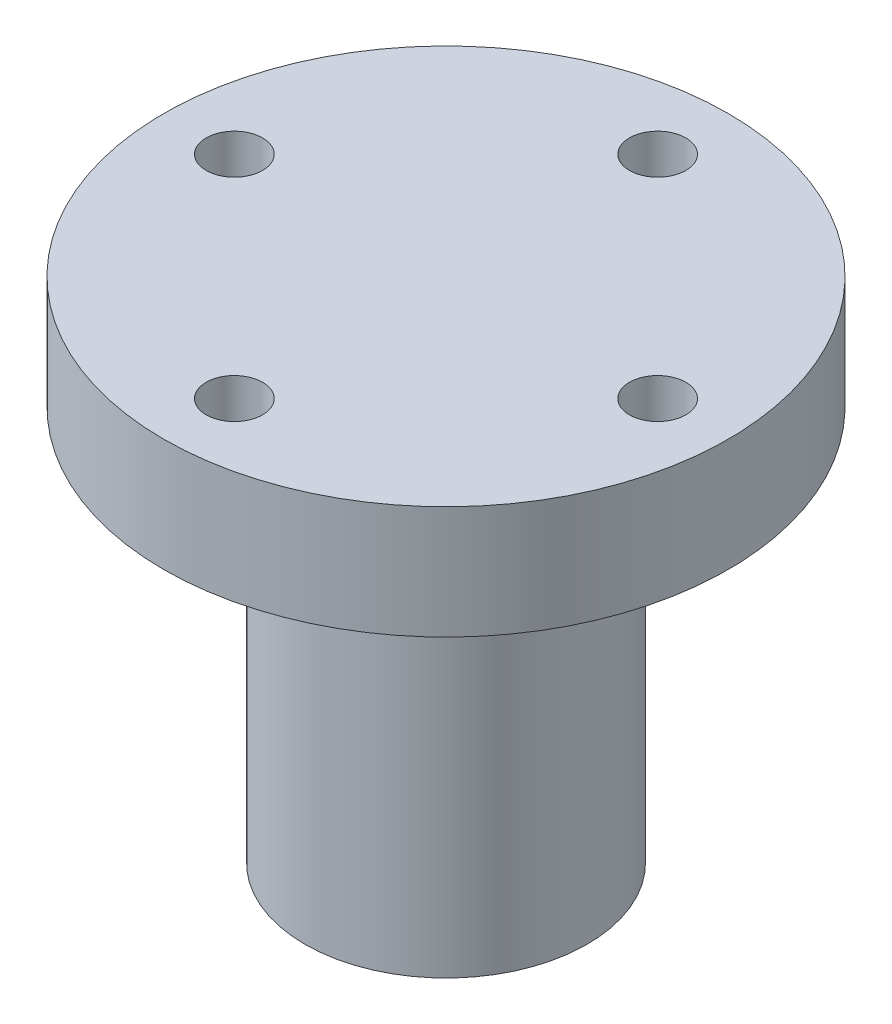
ISO-10303-21;
HEADER;
FILE_DESCRIPTION(('STEP AP214'),'2;1');
FILE_NAME('part.step','',(''),(''),'','','');
FILE_SCHEMA(('AUTOMOTIVE_DESIGN { 1 0 10303 214 1 1 1 1 }'));
ENDSEC;
DATA;
#1=APPLICATION_CONTEXT('core data for automotive mechanical design processes');
#2=APPLICATION_PROTOCOL_DEFINITION('international standard','automotive_design',2000,#1);
#3=PRODUCT_CONTEXT('',#1,'mechanical');
#4=PRODUCT('Part','Part','',(#3));
#5=PRODUCT_RELATED_PRODUCT_CATEGORY('part','',(#4));
#6=PRODUCT_DEFINITION_FORMATION('','',#4);
#7=PRODUCT_DEFINITION_CONTEXT('part definition',#1,'design');
#8=PRODUCT_DEFINITION('design','',#6,#7);
#9=PRODUCT_DEFINITION_SHAPE('','',#8);
#10=(LENGTH_UNIT() NAMED_UNIT(*) SI_UNIT(.MILLI.,.METRE.));
#11=(NAMED_UNIT(*) PLANE_ANGLE_UNIT() SI_UNIT($,.RADIAN.));
#12=(NAMED_UNIT(*) SI_UNIT($,.STERADIAN.) SOLID_ANGLE_UNIT());
#13=UNCERTAINTY_MEASURE_WITH_UNIT(LENGTH_MEASURE(1.E-05),#10,'distance_accuracy_value','');
#14=(GEOMETRIC_REPRESENTATION_CONTEXT(3) GLOBAL_UNCERTAINTY_ASSIGNED_CONTEXT((#13)) GLOBAL_UNIT_ASSIGNED_CONTEXT((#10,
#11,#12)) REPRESENTATION_CONTEXT('',''));
#15=CARTESIAN_POINT('',(0.,0.,0.));
#16=DIRECTION('',(0.,0.,1.));
#17=DIRECTION('',(1.,0.,0.));
#18=AXIS2_PLACEMENT_3D('',#15,#16,#17);
#19=CARTESIAN_POINT('',(0.,35.,0.));
#20=DIRECTION('',(0.,-1.,0.));
#21=DIRECTION('',(0.,0.,-1.));
#22=AXIS2_PLACEMENT_3D('',#19,#20,#21);
#23=CYLINDRICAL_SURFACE('',#22,25.);
#24=CARTESIAN_POINT('',(0.,35.,0.));
#25=DIRECTION('',(0.,1.,0.));
#26=DIRECTION('',(0.,0.,1.));
#27=AXIS2_PLACEMENT_3D('',#24,#25,#26);
#28=CIRCLE('',#27,25.);
#29=CARTESIAN_POINT('',(0.,35.,25.));
#30=VERTEX_POINT('',#29);
#31=EDGE_CURVE('E10',#30,#30,#28,.T.);
#32=ORIENTED_EDGE('',*,*,#31,.F.);
#33=EDGE_LOOP('',(#32));
#34=FACE_BOUND('',#33,.T.);
#35=CARTESIAN_POINT('',(0.,-35.,0.));
#36=DIRECTION('',(0.,1.,0.));
#37=DIRECTION('',(0.,0.,1.));
#38=AXIS2_PLACEMENT_3D('',#35,#36,#37);
#39=CIRCLE('',#38,25.);
#40=CARTESIAN_POINT('',(0.,-35.,25.));
#41=VERTEX_POINT('',#40);
#42=EDGE_CURVE('E34',#41,#41,#39,.T.);
#43=ORIENTED_EDGE('',*,*,#42,.T.);
#44=EDGE_LOOP('',(#43));
#45=FACE_BOUND('',#44,.T.);
#46=ADVANCED_FACE('F31',(#34,#45),#23,.T.);
#47=CARTESIAN_POINT('',(0.,-35.,0.));
#48=DIRECTION('',(0.,1.,0.));
#49=DIRECTION('',(0.,0.,1.));
#50=AXIS2_PLACEMENT_3D('',#47,#48,#49);
#51=PLANE('',#50);
#52=ORIENTED_EDGE('',*,*,#42,.F.);
#53=EDGE_LOOP('',(#52));
#54=FACE_BOUND('',#53,.T.);
#55=ADVANCED_FACE('F92',(#54),#51,.F.);
#56=CARTESIAN_POINT('',(0.,55.,0.));
#57=DIRECTION('',(0.,-1.,0.));
#58=DIRECTION('',(0.,0.,-1.));
#59=AXIS2_PLACEMENT_3D('',#56,#57,#58);
#60=CYLINDRICAL_SURFACE('',#59,50.);
#61=CARTESIAN_POINT('',(0.,55.,0.));
#62=DIRECTION('',(0.,1.,0.));
#63=DIRECTION('',(0.,0.,1.));
#64=AXIS2_PLACEMENT_3D('',#61,#62,#63);
#65=CIRCLE('',#64,50.);
#66=CARTESIAN_POINT('',(0.,55.,50.));
#67=VERTEX_POINT('',#66);
#68=EDGE_CURVE('E41',#67,#67,#65,.T.);
#69=ORIENTED_EDGE('',*,*,#68,.F.);
#70=EDGE_LOOP('',(#69));
#71=FACE_BOUND('',#70,.T.);
#72=CARTESIAN_POINT('',(0.,35.,0.));
#73=DIRECTION('',(0.,1.,0.));
#74=DIRECTION('',(0.,0.,1.));
#75=AXIS2_PLACEMENT_3D('',#72,#73,#74);
#76=CIRCLE('',#75,50.);
#77=CARTESIAN_POINT('',(0.,35.,50.));
#78=VERTEX_POINT('',#77);
#79=EDGE_CURVE('E43',#78,#78,#76,.T.);
#80=ORIENTED_EDGE('',*,*,#79,.T.);
#81=EDGE_LOOP('',(#80));
#82=FACE_BOUND('',#81,.T.);
#83=ADVANCED_FACE('F80',(#71,#82),#60,.T.);
#84=CARTESIAN_POINT('',(0.,55.,0.));
#85=DIRECTION('',(0.,1.,0.));
#86=DIRECTION('',(0.,0.,1.));
#87=AXIS2_PLACEMENT_3D('',#84,#85,#86);
#88=PLANE('',#87);
#89=CARTESIAN_POINT('',(0.,55.,-37.5));
#90=DIRECTION('',(0.,1.,0.));
#91=DIRECTION('',(0.,0.,1.));
#92=AXIS2_PLACEMENT_3D('',#89,#90,#91);
#93=CIRCLE('',#92,5.);
#94=CARTESIAN_POINT('',(0.,55.,-32.5));
#95=VERTEX_POINT('',#94);
#96=EDGE_CURVE('E65',#95,#95,#93,.T.);
#97=ORIENTED_EDGE('',*,*,#96,.F.);
#98=EDGE_LOOP('',(#97));
#99=FACE_BOUND('',#98,.T.);
#100=CARTESIAN_POINT('',(37.5,55.,1.30930550206618E-13));
#101=DIRECTION('',(0.,1.,0.));
#102=DIRECTION('',(0.,0.,1.));
#103=AXIS2_PLACEMENT_3D('',#100,#101,#102);
#104=CIRCLE('',#103,5.);
#105=CARTESIAN_POINT('',(37.5,55.,5.00000000000013));
#106=VERTEX_POINT('',#105);
#107=EDGE_CURVE('E59',#106,#106,#104,.T.);
#108=ORIENTED_EDGE('',*,*,#107,.F.);
#109=EDGE_LOOP('',(#108));
#110=FACE_BOUND('',#109,.T.);
#111=CARTESIAN_POINT('',(-2.61861100413235E-13,55.,37.5));
#112=DIRECTION('',(0.,1.,0.));
#113=DIRECTION('',(0.,0.,1.));
#114=AXIS2_PLACEMENT_3D('',#111,#112,#113);
#115=CIRCLE('',#114,5.);
#116=CARTESIAN_POINT('',(-2.61861100413235E-13,55.,42.5));
#117=VERTEX_POINT('',#116);
#118=EDGE_CURVE('E52',#117,#117,#115,.T.);
#119=ORIENTED_EDGE('',*,*,#118,.F.);
#120=EDGE_LOOP('',(#119));
#121=FACE_BOUND('',#120,.T.);
#122=CARTESIAN_POINT('',(-37.5,55.,-3.92791650619852E-13));
#123=DIRECTION('',(0.,1.,0.));
#124=DIRECTION('',(0.,0.,1.));
#125=AXIS2_PLACEMENT_3D('',#122,#123,#124);
#126=CIRCLE('',#125,5.);
#127=CARTESIAN_POINT('',(-37.5,55.,4.99999999999961));
#128=VERTEX_POINT('',#127);
#129=EDGE_CURVE('E53',#128,#128,#126,.T.);
#130=ORIENTED_EDGE('',*,*,#129,.F.);
#131=EDGE_LOOP('',(#130));
#132=FACE_BOUND('',#131,.T.);
#133=ORIENTED_EDGE('',*,*,#68,.T.);
#134=EDGE_LOOP('',(#133));
#135=FACE_BOUND('',#134,.T.);
#136=ADVANCED_FACE('F76',(#99,#110,#121,#132,#135),#88,.T.);
#137=CARTESIAN_POINT('',(0.,35.,0.));
#138=DIRECTION('',(0.,1.,0.));
#139=DIRECTION('',(0.,0.,1.));
#140=AXIS2_PLACEMENT_3D('',#137,#138,#139);
#141=PLANE('',#140);
#142=CARTESIAN_POINT('',(0.,35.,-37.5));
#143=DIRECTION('',(0.,1.,0.));
#144=DIRECTION('',(0.,0.,1.));
#145=AXIS2_PLACEMENT_3D('',#142,#143,#144);
#146=CIRCLE('',#145,5.);
#147=CARTESIAN_POINT('',(0.,35.,-32.5));
#148=VERTEX_POINT('',#147);
#149=EDGE_CURVE('E46',#148,#148,#146,.F.);
#150=ORIENTED_EDGE('',*,*,#149,.F.);
#151=EDGE_LOOP('',(#150));
#152=FACE_BOUND('',#151,.T.);
#153=CARTESIAN_POINT('',(37.5,35.,1.30930550206618E-13));
#154=DIRECTION('',(0.,1.,0.));
#155=DIRECTION('',(0.,0.,1.));
#156=AXIS2_PLACEMENT_3D('',#153,#154,#155);
#157=CIRCLE('',#156,5.);
#158=CARTESIAN_POINT('',(37.5,35.,5.00000000000013));
#159=VERTEX_POINT('',#158);
#160=EDGE_CURVE('E62',#159,#159,#157,.F.);
#161=ORIENTED_EDGE('',*,*,#160,.F.);
#162=EDGE_LOOP('',(#161));
#163=FACE_BOUND('',#162,.T.);
#164=CARTESIAN_POINT('',(-2.61861100413235E-13,35.,37.5));
#165=DIRECTION('',(0.,1.,0.));
#166=DIRECTION('',(0.,0.,1.));
#167=AXIS2_PLACEMENT_3D('',#164,#165,#166);
#168=CIRCLE('',#167,5.);
#169=CARTESIAN_POINT('',(-2.61861100413235E-13,35.,42.5));
#170=VERTEX_POINT('',#169);
#171=EDGE_CURVE('E56',#170,#170,#168,.F.);
#172=ORIENTED_EDGE('',*,*,#171,.F.);
#173=EDGE_LOOP('',(#172));
#174=FACE_BOUND('',#173,.T.);
#175=CARTESIAN_POINT('',(-37.5,35.,-3.92791650619852E-13));
#176=DIRECTION('',(0.,1.,0.));
#177=DIRECTION('',(0.,0.,1.));
#178=AXIS2_PLACEMENT_3D('',#175,#176,#177);
#179=CIRCLE('',#178,5.);
#180=CARTESIAN_POINT('',(-37.5,35.,4.99999999999961));
#181=VERTEX_POINT('',#180);
#182=EDGE_CURVE('E49',#181,#181,#179,.F.);
#183=ORIENTED_EDGE('',*,*,#182,.F.);
#184=EDGE_LOOP('',(#183));
#185=FACE_BOUND('',#184,.T.);
#186=ORIENTED_EDGE('',*,*,#31,.T.);
#187=EDGE_LOOP('',(#186));
#188=FACE_BOUND('',#187,.T.);
#189=ORIENTED_EDGE('',*,*,#79,.F.);
#190=EDGE_LOOP('',(#189));
#191=FACE_BOUND('',#190,.T.);
#192=ADVANCED_FACE('F79',(#152,#163,#174,#185,#188,#191),#141,.F.);
#193=CARTESIAN_POINT('',(-37.5,-35.001,-3.92791650619852E-13));
#194=DIRECTION('',(0.,1.,0.));
#195=DIRECTION('',(0.,0.,1.));
#196=AXIS2_PLACEMENT_3D('',#193,#194,#195);
#197=CYLINDRICAL_SURFACE('',#196,5.);
#198=CARTESIAN_POINT('',(-37.5,55.,4.99999999999961));
#199=CARTESIAN_POINT('',(-37.5,54.7916666666667,4.99999999999961));
#200=CARTESIAN_POINT('',(-37.5,54.5833333333333,4.99999999999961));
#201=CARTESIAN_POINT('',(-37.5,54.1666666666667,4.99999999999961));
#202=CARTESIAN_POINT('',(-37.5,53.9583333333333,4.99999999999961));
#203=CARTESIAN_POINT('',(-37.5,53.5416666666667,4.99999999999961));
#204=CARTESIAN_POINT('',(-37.5,53.3333333333333,4.99999999999961));
#205=CARTESIAN_POINT('',(-37.5,52.9166666666667,4.99999999999961));
#206=CARTESIAN_POINT('',(-37.5,52.7083333333333,4.99999999999961));
#207=CARTESIAN_POINT('',(-37.5,52.2916666666667,4.99999999999961));
#208=CARTESIAN_POINT('',(-37.5,52.0833333333333,4.99999999999961));
#209=CARTESIAN_POINT('',(-37.5,51.6666666666667,4.99999999999961));
#210=CARTESIAN_POINT('',(-37.5,51.4583333333333,4.99999999999961));
#211=CARTESIAN_POINT('',(-37.5,51.0416666666667,4.99999999999961));
#212=CARTESIAN_POINT('',(-37.5,50.8333333333333,4.99999999999961));
#213=CARTESIAN_POINT('',(-37.5,50.4166666666667,4.99999999999961));
#214=CARTESIAN_POINT('',(-37.5,50.2083333333333,4.99999999999961));
#215=CARTESIAN_POINT('',(-37.5,49.7916666666667,4.99999999999961));
#216=CARTESIAN_POINT('',(-37.5,49.5833333333333,4.99999999999961));
#217=CARTESIAN_POINT('',(-37.5,49.1666666666667,4.99999999999961));
#218=CARTESIAN_POINT('',(-37.5,48.9583333333333,4.99999999999961));
#219=CARTESIAN_POINT('',(-37.5,48.5416666666667,4.99999999999961));
#220=CARTESIAN_POINT('',(-37.5,48.3333333333333,4.99999999999961));
#221=CARTESIAN_POINT('',(-37.5,47.9166666666667,4.99999999999961));
#222=CARTESIAN_POINT('',(-37.5,47.7083333333333,4.99999999999961));
#223=CARTESIAN_POINT('',(-37.5,47.2916666666667,4.99999999999961));
#224=CARTESIAN_POINT('',(-37.5,47.0833333333333,4.99999999999961));
#225=CARTESIAN_POINT('',(-37.5,46.6666666666667,4.99999999999961));
#226=CARTESIAN_POINT('',(-37.5,46.4583333333333,4.99999999999961));
#227=CARTESIAN_POINT('',(-37.5,46.0416666666667,4.99999999999961));
#228=CARTESIAN_POINT('',(-37.5,45.8333333333333,4.99999999999961));
#229=CARTESIAN_POINT('',(-37.5,45.4166666666667,4.99999999999961));
#230=CARTESIAN_POINT('',(-37.5,45.2083333333333,4.99999999999961));
#231=CARTESIAN_POINT('',(-37.5,44.7916666666667,4.99999999999961));
#232=CARTESIAN_POINT('',(-37.5,44.5833333333333,4.99999999999961));
#233=CARTESIAN_POINT('',(-37.5,44.1666666666667,4.99999999999961));
#234=CARTESIAN_POINT('',(-37.5,43.9583333333333,4.99999999999961));
#235=CARTESIAN_POINT('',(-37.5,43.5416666666667,4.99999999999961));
#236=CARTESIAN_POINT('',(-37.5,43.3333333333333,4.99999999999961));
#237=CARTESIAN_POINT('',(-37.5,42.9166666666667,4.99999999999961));
#238=CARTESIAN_POINT('',(-37.5,42.7083333333333,4.99999999999961));
#239=CARTESIAN_POINT('',(-37.5,42.2916666666667,4.99999999999961));
#240=CARTESIAN_POINT('',(-37.5,42.0833333333333,4.99999999999961));
#241=CARTESIAN_POINT('',(-37.5,41.6666666666667,4.99999999999961));
#242=CARTESIAN_POINT('',(-37.5,41.4583333333333,4.99999999999961));
#243=CARTESIAN_POINT('',(-37.5,41.0416666666667,4.99999999999961));
#244=CARTESIAN_POINT('',(-37.5,40.8333333333333,4.99999999999961));
#245=CARTESIAN_POINT('',(-37.5,40.4166666666667,4.99999999999961));
#246=CARTESIAN_POINT('',(-37.5,40.2083333333333,4.99999999999961));
#247=CARTESIAN_POINT('',(-37.5,39.7916666666667,4.99999999999961));
#248=CARTESIAN_POINT('',(-37.5,39.5833333333333,4.99999999999961));
#249=CARTESIAN_POINT('',(-37.5,39.1666666666667,4.99999999999961));
#250=CARTESIAN_POINT('',(-37.5,38.9583333333333,4.99999999999961));
#251=CARTESIAN_POINT('',(-37.5,38.5416666666667,4.99999999999961));
#252=CARTESIAN_POINT('',(-37.5,38.3333333333333,4.99999999999961));
#253=CARTESIAN_POINT('',(-37.5,37.9166666666667,4.99999999999961));
#254=CARTESIAN_POINT('',(-37.5,37.7083333333333,4.99999999999961));
#255=CARTESIAN_POINT('',(-37.5,37.2916666666667,4.99999999999961));
#256=CARTESIAN_POINT('',(-37.5,37.0833333333333,4.99999999999961));
#257=CARTESIAN_POINT('',(-37.5,36.6666666666667,4.99999999999961));
#258=CARTESIAN_POINT('',(-37.5,36.4583333333333,4.99999999999961));
#259=CARTESIAN_POINT('',(-37.5,36.0416666666667,4.99999999999961));
#260=CARTESIAN_POINT('',(-37.5,35.8333333333333,4.99999999999961));
#261=CARTESIAN_POINT('',(-37.5,35.4166666666667,4.99999999999961));
#262=CARTESIAN_POINT('',(-37.5,35.2083333333333,4.99999999999961));
#263=CARTESIAN_POINT('',(-37.5,35.,4.99999999999961));
#264=B_SPLINE_CURVE_WITH_KNOTS('',3,(#198,#199,#200,#201,#202,#203,#204,#205,#206,#207,#208,
#209,#210,#211,#212,#213,#214,#215,#216,#217,#218,#219,#220,#221,#222,#223,#224,#225,#226,#227,
#228,#229,#230,#231,#232,#233,#234,#235,#236,#237,#238,#239,#240,#241,#242,#243,#244,#245,#246,
#247,#248,#249,#250,#251,#252,#253,#254,#255,#256,#257,#258,#259,#260,#261,#262,#263),
.UNSPECIFIED.,.F.,.F.,(4,2,2,2,2,2,2,2,2,2,2,2,2,2,2,2,2,2,2,2,2,2,2,2,2,2,2,2,2,2,2,2,4),(0.,
0.625000000000001,1.25,1.875,2.5,3.125,3.75,4.375,5.,5.62500000000001,6.25000000000001,
6.87500000000001,7.50000000000001,8.12500000000001,8.75000000000001,9.37500000000001,10.,10.625,
11.25,11.875,12.5,13.125,13.75,14.375,15.,15.625,16.25,16.875,17.5,18.125,18.75,19.375,20.),.UNSPECIFIED.);
#265=EDGE_CURVE('BSEAM97',#128,#181,#264,.T.);
#266=ORIENTED_EDGE('',*,*,#129,.T.);
#267=ORIENTED_EDGE('',*,*,#182,.T.);
#268=ORIENTED_EDGE('',*,*,#265,.T.);
#269=ORIENTED_EDGE('',*,*,#265,.F.);
#270=EDGE_LOOP('',(#266,#268,#267,#269));
#271=FACE_BOUND('',#270,.T.);
#272=ADVANCED_FACE('F97',(#271),#197,.F.);
#273=CARTESIAN_POINT('',(-2.61861100413235E-13,-35.001,37.5));
#274=DIRECTION('',(0.,1.,0.));
#275=DIRECTION('',(0.,0.,1.));
#276=AXIS2_PLACEMENT_3D('',#273,#274,#275);
#277=CYLINDRICAL_SURFACE('',#276,5.);
#278=CARTESIAN_POINT('',(-2.61861100413235E-13,55.,42.5));
#279=CARTESIAN_POINT('',(-2.61861100413235E-13,54.7916666666667,42.5));
#280=CARTESIAN_POINT('',(-2.61861100413235E-13,54.5833333333333,42.5));
#281=CARTESIAN_POINT('',(-2.61861100413235E-13,54.1666666666667,42.5));
#282=CARTESIAN_POINT('',(-2.61861100413235E-13,53.9583333333333,42.5));
#283=CARTESIAN_POINT('',(-2.61861100413235E-13,53.5416666666667,42.5));
#284=CARTESIAN_POINT('',(-2.61861100413235E-13,53.3333333333333,42.5));
#285=CARTESIAN_POINT('',(-2.61861100413235E-13,52.9166666666667,42.5));
#286=CARTESIAN_POINT('',(-2.61861100413235E-13,52.7083333333333,42.5));
#287=CARTESIAN_POINT('',(-2.61861100413235E-13,52.2916666666667,42.5));
#288=CARTESIAN_POINT('',(-2.61861100413235E-13,52.0833333333333,42.5));
#289=CARTESIAN_POINT('',(-2.61861100413235E-13,51.6666666666667,42.5));
#290=CARTESIAN_POINT('',(-2.61861100413235E-13,51.4583333333333,42.5));
#291=CARTESIAN_POINT('',(-2.61861100413235E-13,51.0416666666667,42.5));
#292=CARTESIAN_POINT('',(-2.61861100413235E-13,50.8333333333333,42.5));
#293=CARTESIAN_POINT('',(-2.61861100413235E-13,50.4166666666667,42.5));
#294=CARTESIAN_POINT('',(-2.61861100413235E-13,50.2083333333333,42.5));
#295=CARTESIAN_POINT('',(-2.61861100413235E-13,49.7916666666667,42.5));
#296=CARTESIAN_POINT('',(-2.61861100413235E-13,49.5833333333333,42.5));
#297=CARTESIAN_POINT('',(-2.61861100413235E-13,49.1666666666667,42.5));
#298=CARTESIAN_POINT('',(-2.61861100413235E-13,48.9583333333333,42.5));
#299=CARTESIAN_POINT('',(-2.61861100413235E-13,48.5416666666667,42.5));
#300=CARTESIAN_POINT('',(-2.61861100413235E-13,48.3333333333333,42.5));
#301=CARTESIAN_POINT('',(-2.61861100413235E-13,47.9166666666667,42.5));
#302=CARTESIAN_POINT('',(-2.61861100413235E-13,47.7083333333333,42.5));
#303=CARTESIAN_POINT('',(-2.61861100413235E-13,47.2916666666667,42.5));
#304=CARTESIAN_POINT('',(-2.61861100413235E-13,47.0833333333333,42.5));
#305=CARTESIAN_POINT('',(-2.61861100413235E-13,46.6666666666667,42.5));
#306=CARTESIAN_POINT('',(-2.61861100413235E-13,46.4583333333333,42.5));
#307=CARTESIAN_POINT('',(-2.61861100413235E-13,46.0416666666667,42.5));
#308=CARTESIAN_POINT('',(-2.61861100413235E-13,45.8333333333333,42.5));
#309=CARTESIAN_POINT('',(-2.61861100413235E-13,45.4166666666667,42.5));
#310=CARTESIAN_POINT('',(-2.61861100413235E-13,45.2083333333333,42.5));
#311=CARTESIAN_POINT('',(-2.61861100413235E-13,44.7916666666667,42.5));
#312=CARTESIAN_POINT('',(-2.61861100413235E-13,44.5833333333333,42.5));
#313=CARTESIAN_POINT('',(-2.61861100413235E-13,44.1666666666667,42.5));
#314=CARTESIAN_POINT('',(-2.61861100413235E-13,43.9583333333333,42.5));
#315=CARTESIAN_POINT('',(-2.61861100413235E-13,43.5416666666667,42.5));
#316=CARTESIAN_POINT('',(-2.61861100413235E-13,43.3333333333333,42.5));
#317=CARTESIAN_POINT('',(-2.61861100413235E-13,42.9166666666667,42.5));
#318=CARTESIAN_POINT('',(-2.61861100413235E-13,42.7083333333333,42.5));
#319=CARTESIAN_POINT('',(-2.61861100413235E-13,42.2916666666667,42.5));
#320=CARTESIAN_POINT('',(-2.61861100413235E-13,42.0833333333333,42.5));
#321=CARTESIAN_POINT('',(-2.61861100413235E-13,41.6666666666667,42.5));
#322=CARTESIAN_POINT('',(-2.61861100413235E-13,41.4583333333333,42.5));
#323=CARTESIAN_POINT('',(-2.61861100413235E-13,41.0416666666667,42.5));
#324=CARTESIAN_POINT('',(-2.61861100413235E-13,40.8333333333333,42.5));
#325=CARTESIAN_POINT('',(-2.61861100413235E-13,40.4166666666667,42.5));
#326=CARTESIAN_POINT('',(-2.61861100413235E-13,40.2083333333333,42.5));
#327=CARTESIAN_POINT('',(-2.61861100413235E-13,39.7916666666667,42.5));
#328=CARTESIAN_POINT('',(-2.61861100413235E-13,39.5833333333333,42.5));
#329=CARTESIAN_POINT('',(-2.61861100413235E-13,39.1666666666667,42.5));
#330=CARTESIAN_POINT('',(-2.61861100413235E-13,38.9583333333333,42.5));
#331=CARTESIAN_POINT('',(-2.61861100413235E-13,38.5416666666667,42.5));
#332=CARTESIAN_POINT('',(-2.61861100413235E-13,38.3333333333333,42.5));
#333=CARTESIAN_POINT('',(-2.61861100413235E-13,37.9166666666667,42.5));
#334=CARTESIAN_POINT('',(-2.61861100413235E-13,37.7083333333333,42.5));
#335=CARTESIAN_POINT('',(-2.61861100413235E-13,37.2916666666667,42.5));
#336=CARTESIAN_POINT('',(-2.61861100413235E-13,37.0833333333333,42.5));
#337=CARTESIAN_POINT('',(-2.61861100413235E-13,36.6666666666667,42.5));
#338=CARTESIAN_POINT('',(-2.61861100413235E-13,36.4583333333333,42.5));
#339=CARTESIAN_POINT('',(-2.61861100413235E-13,36.0416666666667,42.5));
#340=CARTESIAN_POINT('',(-2.61861100413235E-13,35.8333333333333,42.5));
#341=CARTESIAN_POINT('',(-2.61861100413235E-13,35.4166666666667,42.5));
#342=CARTESIAN_POINT('',(-2.61861100413235E-13,35.2083333333333,42.5));
#343=CARTESIAN_POINT('',(-2.61861100413235E-13,35.,42.5));
#344=B_SPLINE_CURVE_WITH_KNOTS('',3,(#278,#279,#280,#281,#282,#283,#284,#285,#286,#287,#288,
#289,#290,#291,#292,#293,#294,#295,#296,#297,#298,#299,#300,#301,#302,#303,#304,#305,#306,#307,
#308,#309,#310,#311,#312,#313,#314,#315,#316,#317,#318,#319,#320,#321,#322,#323,#324,#325,#326,
#327,#328,#329,#330,#331,#332,#333,#334,#335,#336,#337,#338,#339,#340,#341,#342,#343),
.UNSPECIFIED.,.F.,.F.,(4,2,2,2,2,2,2,2,2,2,2,2,2,2,2,2,2,2,2,2,2,2,2,2,2,2,2,2,2,2,2,2,4),(0.,
0.625000000000001,1.25,1.875,2.5,3.125,3.75,4.375,5.,5.62500000000001,6.25000000000001,
6.87500000000001,7.50000000000001,8.12500000000001,8.75000000000001,9.37500000000001,10.,10.625,
11.25,11.875,12.5,13.125,13.75,14.375,15.,15.625,16.25,16.875,17.5,18.125,18.75,19.375,20.),.UNSPECIFIED.);
#345=EDGE_CURVE('BSEAM103',#117,#170,#344,.T.);
#346=ORIENTED_EDGE('',*,*,#118,.T.);
#347=ORIENTED_EDGE('',*,*,#171,.T.);
#348=ORIENTED_EDGE('',*,*,#345,.T.);
#349=ORIENTED_EDGE('',*,*,#345,.F.);
#350=EDGE_LOOP('',(#346,#348,#347,#349));
#351=FACE_BOUND('',#350,.T.);
#352=ADVANCED_FACE('F103',(#351),#277,.F.);
#353=CARTESIAN_POINT('',(37.5,-35.001,1.30930550206618E-13));
#354=DIRECTION('',(0.,1.,0.));
#355=DIRECTION('',(0.,0.,1.));
#356=AXIS2_PLACEMENT_3D('',#353,#354,#355);
#357=CYLINDRICAL_SURFACE('',#356,5.);
#358=CARTESIAN_POINT('',(37.5,55.,5.00000000000013));
#359=CARTESIAN_POINT('',(37.5,54.7916666666667,5.00000000000013));
#360=CARTESIAN_POINT('',(37.5,54.5833333333333,5.00000000000013));
#361=CARTESIAN_POINT('',(37.5,54.1666666666667,5.00000000000013));
#362=CARTESIAN_POINT('',(37.5,53.9583333333333,5.00000000000013));
#363=CARTESIAN_POINT('',(37.5,53.5416666666667,5.00000000000013));
#364=CARTESIAN_POINT('',(37.5,53.3333333333333,5.00000000000013));
#365=CARTESIAN_POINT('',(37.5,52.9166666666667,5.00000000000013));
#366=CARTESIAN_POINT('',(37.5,52.7083333333333,5.00000000000013));
#367=CARTESIAN_POINT('',(37.5,52.2916666666667,5.00000000000013));
#368=CARTESIAN_POINT('',(37.5,52.0833333333333,5.00000000000013));
#369=CARTESIAN_POINT('',(37.5,51.6666666666667,5.00000000000013));
#370=CARTESIAN_POINT('',(37.5,51.4583333333333,5.00000000000013));
#371=CARTESIAN_POINT('',(37.5,51.0416666666667,5.00000000000013));
#372=CARTESIAN_POINT('',(37.5,50.8333333333333,5.00000000000013));
#373=CARTESIAN_POINT('',(37.5,50.4166666666667,5.00000000000013));
#374=CARTESIAN_POINT('',(37.5,50.2083333333333,5.00000000000013));
#375=CARTESIAN_POINT('',(37.5,49.7916666666667,5.00000000000013));
#376=CARTESIAN_POINT('',(37.5,49.5833333333333,5.00000000000013));
#377=CARTESIAN_POINT('',(37.5,49.1666666666667,5.00000000000013));
#378=CARTESIAN_POINT('',(37.5,48.9583333333333,5.00000000000013));
#379=CARTESIAN_POINT('',(37.5,48.5416666666667,5.00000000000013));
#380=CARTESIAN_POINT('',(37.5,48.3333333333333,5.00000000000013));
#381=CARTESIAN_POINT('',(37.5,47.9166666666667,5.00000000000013));
#382=CARTESIAN_POINT('',(37.5,47.7083333333333,5.00000000000013));
#383=CARTESIAN_POINT('',(37.5,47.2916666666667,5.00000000000013));
#384=CARTESIAN_POINT('',(37.5,47.0833333333333,5.00000000000013));
#385=CARTESIAN_POINT('',(37.5,46.6666666666667,5.00000000000013));
#386=CARTESIAN_POINT('',(37.5,46.4583333333333,5.00000000000013));
#387=CARTESIAN_POINT('',(37.5,46.0416666666667,5.00000000000013));
#388=CARTESIAN_POINT('',(37.5,45.8333333333333,5.00000000000013));
#389=CARTESIAN_POINT('',(37.5,45.4166666666667,5.00000000000013));
#390=CARTESIAN_POINT('',(37.5,45.2083333333333,5.00000000000013));
#391=CARTESIAN_POINT('',(37.5,44.7916666666667,5.00000000000013));
#392=CARTESIAN_POINT('',(37.5,44.5833333333333,5.00000000000013));
#393=CARTESIAN_POINT('',(37.5,44.1666666666667,5.00000000000013));
#394=CARTESIAN_POINT('',(37.5,43.9583333333333,5.00000000000013));
#395=CARTESIAN_POINT('',(37.5,43.5416666666667,5.00000000000013));
#396=CARTESIAN_POINT('',(37.5,43.3333333333333,5.00000000000013));
#397=CARTESIAN_POINT('',(37.5,42.9166666666667,5.00000000000013));
#398=CARTESIAN_POINT('',(37.5,42.7083333333333,5.00000000000013));
#399=CARTESIAN_POINT('',(37.5,42.2916666666667,5.00000000000013));
#400=CARTESIAN_POINT('',(37.5,42.0833333333333,5.00000000000013));
#401=CARTESIAN_POINT('',(37.5,41.6666666666667,5.00000000000013));
#402=CARTESIAN_POINT('',(37.5,41.4583333333333,5.00000000000013));
#403=CARTESIAN_POINT('',(37.5,41.0416666666667,5.00000000000013));
#404=CARTESIAN_POINT('',(37.5,40.8333333333333,5.00000000000013));
#405=CARTESIAN_POINT('',(37.5,40.4166666666667,5.00000000000013));
#406=CARTESIAN_POINT('',(37.5,40.2083333333333,5.00000000000013));
#407=CARTESIAN_POINT('',(37.5,39.7916666666667,5.00000000000013));
#408=CARTESIAN_POINT('',(37.5,39.5833333333333,5.00000000000013));
#409=CARTESIAN_POINT('',(37.5,39.1666666666667,5.00000000000013));
#410=CARTESIAN_POINT('',(37.5,38.9583333333333,5.00000000000013));
#411=CARTESIAN_POINT('',(37.5,38.5416666666667,5.00000000000013));
#412=CARTESIAN_POINT('',(37.5,38.3333333333333,5.00000000000013));
#413=CARTESIAN_POINT('',(37.5,37.9166666666667,5.00000000000013));
#414=CARTESIAN_POINT('',(37.5,37.7083333333333,5.00000000000013));
#415=CARTESIAN_POINT('',(37.5,37.2916666666667,5.00000000000013));
#416=CARTESIAN_POINT('',(37.5,37.0833333333333,5.00000000000013));
#417=CARTESIAN_POINT('',(37.5,36.6666666666667,5.00000000000013));
#418=CARTESIAN_POINT('',(37.5,36.4583333333333,5.00000000000013));
#419=CARTESIAN_POINT('',(37.5,36.0416666666667,5.00000000000013));
#420=CARTESIAN_POINT('',(37.5,35.8333333333333,5.00000000000013));
#421=CARTESIAN_POINT('',(37.5,35.4166666666667,5.00000000000013));
#422=CARTESIAN_POINT('',(37.5,35.2083333333333,5.00000000000013));
#423=CARTESIAN_POINT('',(37.5,35.,5.00000000000013));
#424=B_SPLINE_CURVE_WITH_KNOTS('',3,(#358,#359,#360,#361,#362,#363,#364,#365,#366,#367,#368,
#369,#370,#371,#372,#373,#374,#375,#376,#377,#378,#379,#380,#381,#382,#383,#384,#385,#386,#387,
#388,#389,#390,#391,#392,#393,#394,#395,#396,#397,#398,#399,#400,#401,#402,#403,#404,#405,#406,
#407,#408,#409,#410,#411,#412,#413,#414,#415,#416,#417,#418,#419,#420,#421,#422,#423),
.UNSPECIFIED.,.F.,.F.,(4,2,2,2,2,2,2,2,2,2,2,2,2,2,2,2,2,2,2,2,2,2,2,2,2,2,2,2,2,2,2,2,4),(0.,
0.625000000000001,1.25,1.875,2.5,3.125,3.75,4.375,5.,5.62500000000001,6.25000000000001,
6.87500000000001,7.50000000000001,8.12500000000001,8.75000000000001,9.37500000000001,10.,10.625,
11.25,11.875,12.5,13.125,13.75,14.375,15.,15.625,16.25,16.875,17.5,18.125,18.75,19.375,20.),.UNSPECIFIED.);
#425=EDGE_CURVE('BSEAM145',#106,#159,#424,.T.);
#426=ORIENTED_EDGE('',*,*,#107,.T.);
#427=ORIENTED_EDGE('',*,*,#160,.T.);
#428=ORIENTED_EDGE('',*,*,#425,.T.);
#429=ORIENTED_EDGE('',*,*,#425,.F.);
#430=EDGE_LOOP('',(#426,#428,#427,#429));
#431=FACE_BOUND('',#430,.T.);
#432=ADVANCED_FACE('F145',(#431),#357,.F.);
#433=CARTESIAN_POINT('',(0.,-35.001,-37.5));
#434=DIRECTION('',(0.,1.,0.));
#435=DIRECTION('',(0.,0.,1.));
#436=AXIS2_PLACEMENT_3D('',#433,#434,#435);
#437=CYLINDRICAL_SURFACE('',#436,5.);
#438=CARTESIAN_POINT('',(0.,55.,-32.5));
#439=CARTESIAN_POINT('',(0.,54.7916666666667,-32.5));
#440=CARTESIAN_POINT('',(0.,54.5833333333333,-32.5));
#441=CARTESIAN_POINT('',(0.,54.1666666666667,-32.5));
#442=CARTESIAN_POINT('',(0.,53.9583333333333,-32.5));
#443=CARTESIAN_POINT('',(0.,53.5416666666667,-32.5));
#444=CARTESIAN_POINT('',(0.,53.3333333333333,-32.5));
#445=CARTESIAN_POINT('',(0.,52.9166666666667,-32.5));
#446=CARTESIAN_POINT('',(0.,52.7083333333333,-32.5));
#447=CARTESIAN_POINT('',(0.,52.2916666666667,-32.5));
#448=CARTESIAN_POINT('',(0.,52.0833333333333,-32.5));
#449=CARTESIAN_POINT('',(0.,51.6666666666667,-32.5));
#450=CARTESIAN_POINT('',(0.,51.4583333333333,-32.5));
#451=CARTESIAN_POINT('',(0.,51.0416666666667,-32.5));
#452=CARTESIAN_POINT('',(0.,50.8333333333333,-32.5));
#453=CARTESIAN_POINT('',(0.,50.4166666666667,-32.5));
#454=CARTESIAN_POINT('',(0.,50.2083333333333,-32.5));
#455=CARTESIAN_POINT('',(0.,49.7916666666667,-32.5));
#456=CARTESIAN_POINT('',(0.,49.5833333333333,-32.5));
#457=CARTESIAN_POINT('',(0.,49.1666666666667,-32.5));
#458=CARTESIAN_POINT('',(0.,48.9583333333333,-32.5));
#459=CARTESIAN_POINT('',(0.,48.5416666666667,-32.5));
#460=CARTESIAN_POINT('',(0.,48.3333333333333,-32.5));
#461=CARTESIAN_POINT('',(0.,47.9166666666667,-32.5));
#462=CARTESIAN_POINT('',(0.,47.7083333333333,-32.5));
#463=CARTESIAN_POINT('',(0.,47.2916666666667,-32.5));
#464=CARTESIAN_POINT('',(0.,47.0833333333333,-32.5));
#465=CARTESIAN_POINT('',(0.,46.6666666666667,-32.5));
#466=CARTESIAN_POINT('',(0.,46.4583333333333,-32.5));
#467=CARTESIAN_POINT('',(0.,46.0416666666667,-32.5));
#468=CARTESIAN_POINT('',(0.,45.8333333333333,-32.5));
#469=CARTESIAN_POINT('',(0.,45.4166666666667,-32.5));
#470=CARTESIAN_POINT('',(0.,45.2083333333333,-32.5));
#471=CARTESIAN_POINT('',(0.,44.7916666666667,-32.5));
#472=CARTESIAN_POINT('',(0.,44.5833333333333,-32.5));
#473=CARTESIAN_POINT('',(0.,44.1666666666667,-32.5));
#474=CARTESIAN_POINT('',(0.,43.9583333333333,-32.5));
#475=CARTESIAN_POINT('',(0.,43.5416666666667,-32.5));
#476=CARTESIAN_POINT('',(0.,43.3333333333333,-32.5));
#477=CARTESIAN_POINT('',(0.,42.9166666666667,-32.5));
#478=CARTESIAN_POINT('',(0.,42.7083333333333,-32.5));
#479=CARTESIAN_POINT('',(0.,42.2916666666667,-32.5));
#480=CARTESIAN_POINT('',(0.,42.0833333333333,-32.5));
#481=CARTESIAN_POINT('',(0.,41.6666666666667,-32.5));
#482=CARTESIAN_POINT('',(0.,41.4583333333333,-32.5));
#483=CARTESIAN_POINT('',(0.,41.0416666666667,-32.5));
#484=CARTESIAN_POINT('',(0.,40.8333333333333,-32.5));
#485=CARTESIAN_POINT('',(0.,40.4166666666667,-32.5));
#486=CARTESIAN_POINT('',(0.,40.2083333333333,-32.5));
#487=CARTESIAN_POINT('',(0.,39.7916666666667,-32.5));
#488=CARTESIAN_POINT('',(0.,39.5833333333333,-32.5));
#489=CARTESIAN_POINT('',(0.,39.1666666666667,-32.5));
#490=CARTESIAN_POINT('',(0.,38.9583333333333,-32.5));
#491=CARTESIAN_POINT('',(0.,38.5416666666667,-32.5));
#492=CARTESIAN_POINT('',(0.,38.3333333333333,-32.5));
#493=CARTESIAN_POINT('',(0.,37.9166666666667,-32.5));
#494=CARTESIAN_POINT('',(0.,37.7083333333333,-32.5));
#495=CARTESIAN_POINT('',(0.,37.2916666666667,-32.5));
#496=CARTESIAN_POINT('',(0.,37.0833333333333,-32.5));
#497=CARTESIAN_POINT('',(0.,36.6666666666667,-32.5));
#498=CARTESIAN_POINT('',(0.,36.4583333333333,-32.5));
#499=CARTESIAN_POINT('',(0.,36.0416666666667,-32.5));
#500=CARTESIAN_POINT('',(0.,35.8333333333333,-32.5));
#501=CARTESIAN_POINT('',(0.,35.4166666666667,-32.5));
#502=CARTESIAN_POINT('',(0.,35.2083333333333,-32.5));
#503=CARTESIAN_POINT('',(0.,35.,-32.5));
#504=B_SPLINE_CURVE_WITH_KNOTS('',3,(#438,#439,#440,#441,#442,#443,#444,#445,#446,#447,#448,
#449,#450,#451,#452,#453,#454,#455,#456,#457,#458,#459,#460,#461,#462,#463,#464,#465,#466,#467,
#468,#469,#470,#471,#472,#473,#474,#475,#476,#477,#478,#479,#480,#481,#482,#483,#484,#485,#486,
#487,#488,#489,#490,#491,#492,#493,#494,#495,#496,#497,#498,#499,#500,#501,#502,#503),
.UNSPECIFIED.,.F.,.F.,(4,2,2,2,2,2,2,2,2,2,2,2,2,2,2,2,2,2,2,2,2,2,2,2,2,2,2,2,2,2,2,2,4),(0.,
0.625000000000001,1.25,1.875,2.5,3.125,3.75,4.375,5.,5.62500000000001,6.25000000000001,
6.87500000000001,7.50000000000001,8.12500000000001,8.75000000000001,9.37500000000001,10.,10.625,
11.25,11.875,12.5,13.125,13.75,14.375,15.,15.625,16.25,16.875,17.5,18.125,18.75,19.375,20.),.UNSPECIFIED.);
#505=EDGE_CURVE('BSEAM73',#95,#148,#504,.T.);
#506=ORIENTED_EDGE('',*,*,#96,.T.);
#507=ORIENTED_EDGE('',*,*,#149,.T.);
#508=ORIENTED_EDGE('',*,*,#505,.T.);
#509=ORIENTED_EDGE('',*,*,#505,.F.);
#510=EDGE_LOOP('',(#506,#508,#507,#509));
#511=FACE_BOUND('',#510,.T.);
#512=ADVANCED_FACE('F73',(#511),#437,.F.);
#513=CLOSED_SHELL('',(#46,#55,#83,#136,#192,#272,#352,#432,#512));
#514=MANIFOLD_SOLID_BREP('B2',#513);
#515=ADVANCED_BREP_SHAPE_REPRESENTATION('',(#18,#514),#14);
#516=SHAPE_DEFINITION_REPRESENTATION(#9,#515);
ENDSEC;
END-ISO-10303-21;
